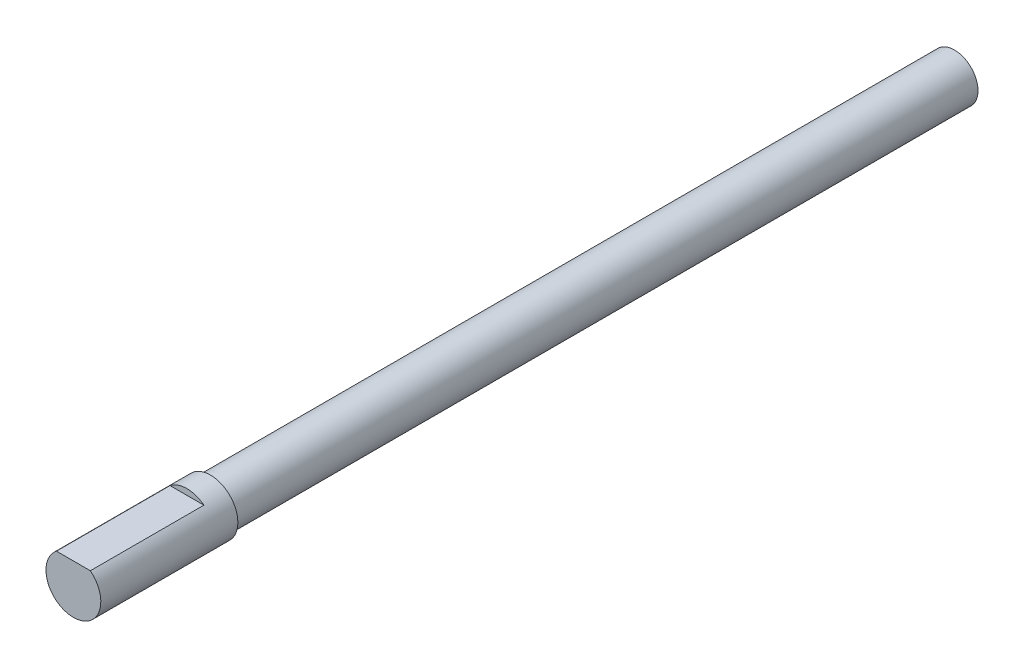
ISO-10303-21;
HEADER;
FILE_DESCRIPTION(('STEP AP214'),'2;1');
FILE_NAME('part.step','',(''),(''),'','','');
FILE_SCHEMA(('AUTOMOTIVE_DESIGN { 1 0 10303 214 1 1 1 1 }'));
ENDSEC;
DATA;
#1=APPLICATION_CONTEXT('core data for automotive mechanical design processes');
#2=APPLICATION_PROTOCOL_DEFINITION('international standard','automotive_design',2000,#1);
#3=PRODUCT_CONTEXT('',#1,'mechanical');
#4=PRODUCT('Part','Part','',(#3));
#5=PRODUCT_RELATED_PRODUCT_CATEGORY('part','',(#4));
#6=PRODUCT_DEFINITION_FORMATION('','',#4);
#7=PRODUCT_DEFINITION_CONTEXT('part definition',#1,'design');
#8=PRODUCT_DEFINITION('design','',#6,#7);
#9=PRODUCT_DEFINITION_SHAPE('','',#8);
#10=(LENGTH_UNIT() NAMED_UNIT(*) SI_UNIT(.MILLI.,.METRE.));
#11=(NAMED_UNIT(*) PLANE_ANGLE_UNIT() SI_UNIT($,.RADIAN.));
#12=(NAMED_UNIT(*) SI_UNIT($,.STERADIAN.) SOLID_ANGLE_UNIT());
#13=UNCERTAINTY_MEASURE_WITH_UNIT(LENGTH_MEASURE(1.E-05),#10,'distance_accuracy_value','');
#14=(GEOMETRIC_REPRESENTATION_CONTEXT(3) GLOBAL_UNCERTAINTY_ASSIGNED_CONTEXT((#13)) GLOBAL_UNIT_ASSIGNED_CONTEXT((#10,
#11,#12)) REPRESENTATION_CONTEXT('',''));
#15=CARTESIAN_POINT('',(0.,0.,0.));
#16=DIRECTION('',(0.,0.,1.));
#17=DIRECTION('',(1.,0.,0.));
#18=AXIS2_PLACEMENT_3D('',#15,#16,#17);
#19=CARTESIAN_POINT('',(0.,0.,190.));
#20=DIRECTION('',(0.,0.,-1.));
#21=DIRECTION('',(-1.,0.,0.));
#22=AXIS2_PLACEMENT_3D('',#19,#20,#21);
#23=CYLINDRICAL_SURFACE('',#22,6.);
#24=CARTESIAN_POINT('',(0.,0.,190.));
#25=DIRECTION('',(0.,0.,1.));
#26=DIRECTION('',(1.,0.,0.));
#27=AXIS2_PLACEMENT_3D('',#24,#25,#26);
#28=CIRCLE('',#27,6.);
#29=CARTESIAN_POINT('',(6.,0.,190.));
#30=VERTEX_POINT('',#29);
#31=EDGE_CURVE('E66',#30,#30,#28,.T.);
#32=ORIENTED_EDGE('',*,*,#31,.F.);
#33=EDGE_LOOP('',(#32));
#34=FACE_BOUND('',#33,.T.);
#35=CARTESIAN_POINT('',(0.,0.,0.));
#36=DIRECTION('',(0.,0.,1.));
#37=DIRECTION('',(1.,0.,0.));
#38=AXIS2_PLACEMENT_3D('',#35,#36,#37);
#39=CIRCLE('',#38,6.);
#40=CARTESIAN_POINT('',(6.,0.,0.));
#41=VERTEX_POINT('',#40);
#42=EDGE_CURVE('E74',#41,#41,#39,.T.);
#43=ORIENTED_EDGE('',*,*,#42,.T.);
#44=EDGE_LOOP('',(#43));
#45=FACE_BOUND('',#44,.T.);
#46=ADVANCED_FACE('F37',(#34,#45),#23,.T.);
#47=CARTESIAN_POINT('',(0.,0.,0.));
#48=DIRECTION('',(0.,0.,1.));
#49=DIRECTION('',(1.,0.,0.));
#50=AXIS2_PLACEMENT_3D('',#47,#48,#49);
#51=PLANE('',#50);
#52=CARTESIAN_POINT('',(0.,0.,0.));
#53=DIRECTION('',(0.,0.,-1.));
#54=DIRECTION('',(-1.,0.,0.));
#55=AXIS2_PLACEMENT_3D('',#52,#53,#54);
#56=CIRCLE('',#55,3.);
#57=CARTESIAN_POINT('',(-3.,0.,0.));
#58=VERTEX_POINT('',#57);
#59=EDGE_CURVE('E83',#58,#58,#56,.T.);
#60=ORIENTED_EDGE('',*,*,#59,.F.);
#61=EDGE_LOOP('',(#60));
#62=FACE_BOUND('',#61,.T.);
#63=ORIENTED_EDGE('',*,*,#42,.F.);
#64=EDGE_LOOP('',(#63));
#65=FACE_BOUND('',#64,.T.);
#66=ADVANCED_FACE('F94',(#62,#65),#51,.F.);
#67=CARTESIAN_POINT('',(0.,0.,225.));
#68=DIRECTION('',(0.,0.,-1.));
#69=DIRECTION('',(-1.,0.,0.));
#70=AXIS2_PLACEMENT_3D('',#67,#68,#69);
#71=CYLINDRICAL_SURFACE('',#70,7.);
#72=CARTESIAN_POINT('',(0.,0.,225.));
#73=DIRECTION('',(0.,0.,1.));
#74=DIRECTION('',(1.,0.,0.));
#75=AXIS2_PLACEMENT_3D('',#72,#73,#74);
#76=CIRCLE('',#75,7.);
#77=CARTESIAN_POINT('',(-4.33012701892219,5.5,225.));
#78=VERTEX_POINT('',#77);
#79=CARTESIAN_POINT('',(4.33012701892219,5.5,225.));
#80=VERTEX_POINT('',#79);
#81=EDGE_CURVE('E70',#78,#80,#76,.T.);
#82=ORIENTED_EDGE('',*,*,#81,.F.);
#83=DIRECTION('',(0.,0.,-1.));
#84=VECTOR('',#83,1.);
#85=CARTESIAN_POINT('',(-4.3301270189222,5.5,225.));
#86=LINE('',#85,#84);
#87=CARTESIAN_POINT('',(-4.33012701892219,5.5,196.));
#88=VERTEX_POINT('',#87);
#89=EDGE_CURVE('E51',#78,#88,#86,.T.);
#90=ORIENTED_EDGE('',*,*,#89,.T.);
#91=CARTESIAN_POINT('',(0.,0.,196.));
#92=DIRECTION('',(0.,0.,-1.));
#93=DIRECTION('',(-1.,0.,0.));
#94=AXIS2_PLACEMENT_3D('',#91,#92,#93);
#95=CIRCLE('',#94,7.);
#96=CARTESIAN_POINT('',(4.33012701892219,5.5,196.));
#97=VERTEX_POINT('',#96);
#98=EDGE_CURVE('E11',#88,#97,#95,.T.);
#99=ORIENTED_EDGE('',*,*,#98,.T.);
#100=DIRECTION('',(0.,0.,-1.));
#101=VECTOR('',#100,1.);
#102=CARTESIAN_POINT('',(4.3301270189222,5.5,225.));
#103=LINE('',#102,#101);
#104=EDGE_CURVE('E56',#97,#80,#103,.F.);
#105=ORIENTED_EDGE('',*,*,#104,.T.);
#106=EDGE_LOOP('',(#82,#90,#99,#105));
#107=FACE_BOUND('',#106,.T.);
#108=CARTESIAN_POINT('',(0.,0.,190.));
#109=DIRECTION('',(0.,0.,1.));
#110=DIRECTION('',(1.,0.,0.));
#111=AXIS2_PLACEMENT_3D('',#108,#109,#110);
#112=CIRCLE('',#111,7.);
#113=CARTESIAN_POINT('',(7.,0.,190.));
#114=VERTEX_POINT('',#113);
#115=EDGE_CURVE('E75',#114,#114,#112,.T.);
#116=ORIENTED_EDGE('',*,*,#115,.T.);
#117=EDGE_LOOP('',(#116));
#118=FACE_BOUND('',#117,.T.);
#119=ADVANCED_FACE('F68',(#107,#118),#71,.T.);
#120=CARTESIAN_POINT('',(0.,0.,225.));
#121=DIRECTION('',(0.,0.,1.));
#122=DIRECTION('',(1.,0.,0.));
#123=AXIS2_PLACEMENT_3D('',#120,#121,#122);
#124=PLANE('',#123);
#125=DIRECTION('',(1.,0.,0.));
#126=VECTOR('',#125,1.);
#127=CARTESIAN_POINT('',(0.,5.5,225.));
#128=LINE('',#127,#126);
#129=EDGE_CURVE('E44',#78,#80,#128,.T.);
#130=ORIENTED_EDGE('',*,*,#129,.F.);
#131=ORIENTED_EDGE('',*,*,#81,.T.);
#132=EDGE_LOOP('',(#130,#131));
#133=FACE_BOUND('',#132,.T.);
#134=ADVANCED_FACE('F73',(#133),#124,.T.);
#135=CARTESIAN_POINT('',(0.,0.,190.));
#136=DIRECTION('',(0.,0.,1.));
#137=DIRECTION('',(1.,0.,0.));
#138=AXIS2_PLACEMENT_3D('',#135,#136,#137);
#139=PLANE('',#138);
#140=ORIENTED_EDGE('',*,*,#31,.T.);
#141=EDGE_LOOP('',(#140));
#142=FACE_BOUND('',#141,.T.);
#143=ORIENTED_EDGE('',*,*,#115,.F.);
#144=EDGE_LOOP('',(#143));
#145=FACE_BOUND('',#144,.T.);
#146=ADVANCED_FACE('F89',(#142,#145),#139,.F.);
#147=CARTESIAN_POINT('',(0.,0.,20.));
#148=DIRECTION('',(0.,0.,-1.));
#149=DIRECTION('',(-1.,0.,0.));
#150=AXIS2_PLACEMENT_3D('',#147,#148,#149);
#151=CYLINDRICAL_SURFACE('',#150,3.);
#152=CARTESIAN_POINT('',(0.,0.,20.));
#153=DIRECTION('',(0.,0.,-1.));
#154=DIRECTION('',(-1.,0.,0.));
#155=AXIS2_PLACEMENT_3D('',#152,#153,#154);
#156=CIRCLE('',#155,3.);
#157=CARTESIAN_POINT('',(-3.,0.,20.));
#158=VERTEX_POINT('',#157);
#159=EDGE_CURVE('E80',#158,#158,#156,.T.);
#160=ORIENTED_EDGE('',*,*,#159,.F.);
#161=EDGE_LOOP('',(#160));
#162=FACE_BOUND('',#161,.T.);
#163=ORIENTED_EDGE('',*,*,#59,.T.);
#164=EDGE_LOOP('',(#163));
#165=FACE_BOUND('',#164,.T.);
#166=ADVANCED_FACE('F108',(#162,#165),#151,.F.);
#167=CARTESIAN_POINT('',(0.,0.,20.));
#168=DIRECTION('',(0.,0.,-1.));
#169=DIRECTION('',(-1.,0.,0.));
#170=AXIS2_PLACEMENT_3D('',#167,#168,#169);
#171=PLANE('',#170);
#172=ORIENTED_EDGE('',*,*,#159,.T.);
#173=EDGE_LOOP('',(#172));
#174=FACE_BOUND('',#173,.T.);
#175=ADVANCED_FACE('F113',(#174),#171,.T.);
#176=CARTESIAN_POINT('',(0.,0.,196.));
#177=DIRECTION('',(0.,0.,-1.));
#178=DIRECTION('',(-1.,0.,0.));
#179=AXIS2_PLACEMENT_3D('',#176,#177,#178);
#180=PLANE('',#179);
#181=DIRECTION('',(1.,0.,0.));
#182=VECTOR('',#181,1.);
#183=CARTESIAN_POINT('',(-4.64249812543461,5.5,196.));
#184=LINE('',#183,#182);
#185=EDGE_CURVE('E71',#88,#97,#184,.T.);
#186=ORIENTED_EDGE('',*,*,#185,.T.);
#187=ORIENTED_EDGE('',*,*,#98,.F.);
#188=EDGE_LOOP('',(#186,#187));
#189=FACE_BOUND('',#188,.T.);
#190=ADVANCED_FACE('F117',(#189),#180,.F.);
#191=CARTESIAN_POINT('',(-4.64249812543461,5.5,196.));
#192=DIRECTION('',(0.,-1.,0.));
#193=DIRECTION('',(0.,0.,-1.));
#194=AXIS2_PLACEMENT_3D('',#191,#192,#193);
#195=PLANE('',#194);
#196=ORIENTED_EDGE('',*,*,#129,.T.);
#197=ORIENTED_EDGE('',*,*,#104,.F.);
#198=ORIENTED_EDGE('',*,*,#185,.F.);
#199=ORIENTED_EDGE('',*,*,#89,.F.);
#200=EDGE_LOOP('',(#196,#197,#198,#199));
#201=FACE_BOUND('',#200,.T.);
#202=ADVANCED_FACE('F62',(#201),#195,.F.);
#203=CLOSED_SHELL('',(#46,#66,#119,#134,#146,#166,#175,#190,#202));
#204=MANIFOLD_SOLID_BREP('B2',#203);
#205=ADVANCED_BREP_SHAPE_REPRESENTATION('',(#18,#204),#14);
#206=SHAPE_DEFINITION_REPRESENTATION(#9,#205);
ENDSEC;
END-ISO-10303-21;
